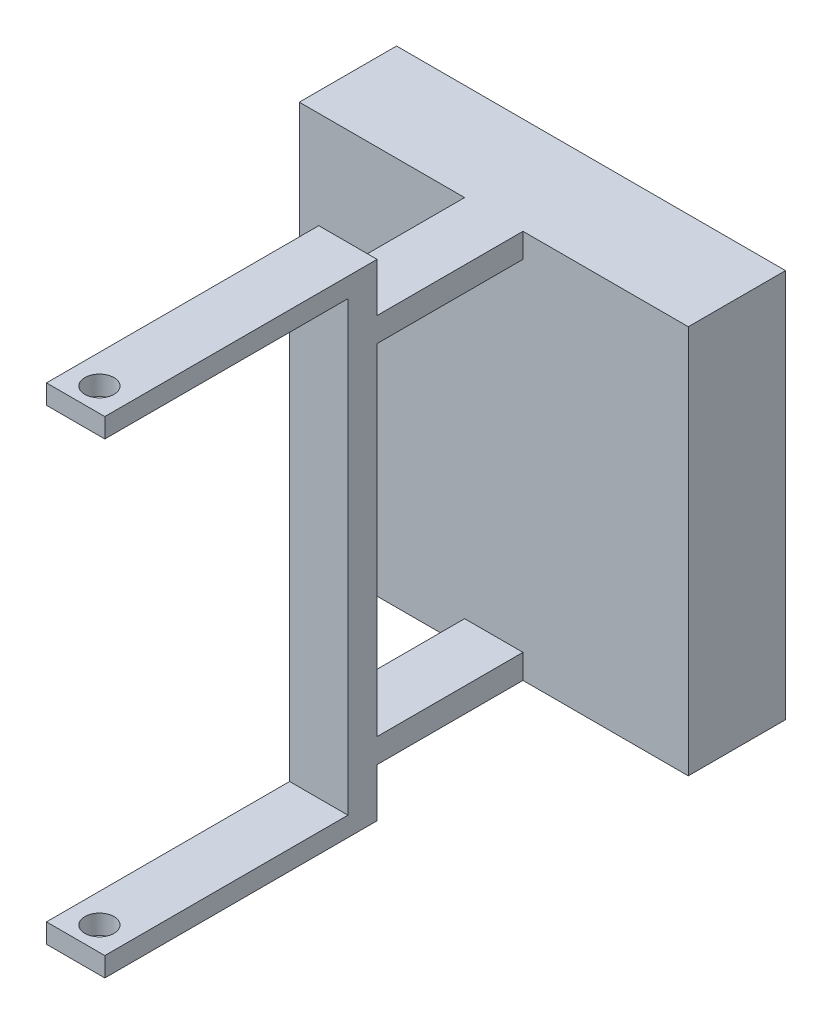
ISO-10303-21;
HEADER;
FILE_DESCRIPTION(('STEP AP214'),'2;1');
FILE_NAME('part.step','',(''),(''),'','','');
FILE_SCHEMA(('AUTOMOTIVE_DESIGN { 1 0 10303 214 1 1 1 1 }'));
ENDSEC;
DATA;
#1=APPLICATION_CONTEXT('core data for automotive mechanical design processes');
#2=APPLICATION_PROTOCOL_DEFINITION('international standard','automotive_design',2000,#1);
#3=PRODUCT_CONTEXT('',#1,'mechanical');
#4=PRODUCT('Part','Part','',(#3));
#5=PRODUCT_RELATED_PRODUCT_CATEGORY('part','',(#4));
#6=PRODUCT_DEFINITION_FORMATION('','',#4);
#7=PRODUCT_DEFINITION_CONTEXT('part definition',#1,'design');
#8=PRODUCT_DEFINITION('design','',#6,#7);
#9=PRODUCT_DEFINITION_SHAPE('','',#8);
#10=(LENGTH_UNIT() NAMED_UNIT(*) SI_UNIT(.MILLI.,.METRE.));
#11=(NAMED_UNIT(*) PLANE_ANGLE_UNIT() SI_UNIT($,.RADIAN.));
#12=(NAMED_UNIT(*) SI_UNIT($,.STERADIAN.) SOLID_ANGLE_UNIT());
#13=UNCERTAINTY_MEASURE_WITH_UNIT(LENGTH_MEASURE(1.E-05),#10,'distance_accuracy_value','');
#14=(GEOMETRIC_REPRESENTATION_CONTEXT(3) GLOBAL_UNCERTAINTY_ASSIGNED_CONTEXT((#13)) GLOBAL_UNIT_ASSIGNED_CONTEXT((#10,
#11,#12)) REPRESENTATION_CONTEXT('',''));
#15=CARTESIAN_POINT('',(0.,0.,0.));
#16=DIRECTION('',(0.,0.,1.));
#17=DIRECTION('',(1.,0.,0.));
#18=AXIS2_PLACEMENT_3D('',#15,#16,#17);
#19=CARTESIAN_POINT('',(0.,0.,10.));
#20=DIRECTION('',(0.,0.,-1.));
#21=DIRECTION('',(-1.,0.,0.));
#22=AXIS2_PLACEMENT_3D('',#19,#20,#21);
#23=PLANE('',#22);
#24=DIRECTION('',(-1.,0.,0.));
#25=VECTOR('',#24,1.);
#26=CARTESIAN_POINT('',(3.,17.5,10.));
#27=LINE('',#26,#25);
#28=CARTESIAN_POINT('',(3.,17.5,10.));
#29=VERTEX_POINT('',#28);
#30=CARTESIAN_POINT('',(-3.,17.5,10.));
#31=VERTEX_POINT('',#30);
#32=EDGE_CURVE('E261',#29,#31,#27,.T.);
#33=ORIENTED_EDGE('',*,*,#32,.T.);
#34=DIRECTION('',(0.,1.,0.));
#35=VECTOR('',#34,1.);
#36=CARTESIAN_POINT('',(-3.,17.5,10.));
#37=LINE('',#36,#35);
#38=CARTESIAN_POINT('',(-3.,20.,10.));
#39=VERTEX_POINT('',#38);
#40=EDGE_CURVE('E250',#31,#39,#37,.T.);
#41=ORIENTED_EDGE('',*,*,#40,.T.);
#42=DIRECTION('',(-1.,0.,0.));
#43=VECTOR('',#42,1.);
#44=CARTESIAN_POINT('',(-20.,20.,10.));
#45=LINE('',#44,#43);
#46=CARTESIAN_POINT('',(-20.,20.,10.));
#47=VERTEX_POINT('',#46);
#48=EDGE_CURVE('E305',#39,#47,#45,.T.);
#49=ORIENTED_EDGE('',*,*,#48,.T.);
#50=DIRECTION('',(0.,-1.,0.));
#51=VECTOR('',#50,1.);
#52=CARTESIAN_POINT('',(-20.,-20.,10.));
#53=LINE('',#52,#51);
#54=CARTESIAN_POINT('',(-20.,-20.,10.));
#55=VERTEX_POINT('',#54);
#56=EDGE_CURVE('E309',#47,#55,#53,.T.);
#57=ORIENTED_EDGE('',*,*,#56,.T.);
#58=DIRECTION('',(1.,0.,0.));
#59=VECTOR('',#58,1.);
#60=CARTESIAN_POINT('',(-20.,-20.,10.));
#61=LINE('',#60,#59);
#62=CARTESIAN_POINT('',(-3.,-20.,10.));
#63=VERTEX_POINT('',#62);
#64=EDGE_CURVE('E312',#55,#63,#61,.T.);
#65=ORIENTED_EDGE('',*,*,#64,.T.);
#66=DIRECTION('',(0.,-1.,0.));
#67=VECTOR('',#66,1.);
#68=CARTESIAN_POINT('',(-3.,-17.5,10.));
#69=LINE('',#68,#67);
#70=CARTESIAN_POINT('',(-3.,-17.5,10.));
#71=VERTEX_POINT('',#70);
#72=EDGE_CURVE('E280',#71,#63,#69,.T.);
#73=ORIENTED_EDGE('',*,*,#72,.F.);
#74=DIRECTION('',(-1.,0.,0.));
#75=VECTOR('',#74,1.);
#76=CARTESIAN_POINT('',(3.,-17.5,10.));
#77=LINE('',#76,#75);
#78=CARTESIAN_POINT('',(3.,-17.5,10.));
#79=VERTEX_POINT('',#78);
#80=EDGE_CURVE('E286',#79,#71,#77,.T.);
#81=ORIENTED_EDGE('',*,*,#80,.F.);
#82=DIRECTION('',(0.,1.,0.));
#83=VECTOR('',#82,1.);
#84=CARTESIAN_POINT('',(3.,-20.,10.));
#85=LINE('',#84,#83);
#86=CARTESIAN_POINT('',(3.,-20.,10.));
#87=VERTEX_POINT('',#86);
#88=EDGE_CURVE('E275',#87,#79,#85,.T.);
#89=ORIENTED_EDGE('',*,*,#88,.F.);
#90=CARTESIAN_POINT('',(20.,-20.,10.));
#91=VERTEX_POINT('',#90);
#92=EDGE_CURVE('E311',#87,#91,#61,.T.);
#93=ORIENTED_EDGE('',*,*,#92,.T.);
#94=DIRECTION('',(0.,1.,0.));
#95=VECTOR('',#94,1.);
#96=CARTESIAN_POINT('',(20.,-20.,10.));
#97=LINE('',#96,#95);
#98=CARTESIAN_POINT('',(20.,20.,10.));
#99=VERTEX_POINT('',#98);
#100=EDGE_CURVE('E302',#91,#99,#97,.T.);
#101=ORIENTED_EDGE('',*,*,#100,.T.);
#102=CARTESIAN_POINT('',(3.,20.,10.));
#103=VERTEX_POINT('',#102);
#104=EDGE_CURVE('E307',#99,#103,#45,.T.);
#105=ORIENTED_EDGE('',*,*,#104,.T.);
#106=DIRECTION('',(0.,-1.,0.));
#107=VECTOR('',#106,1.);
#108=CARTESIAN_POINT('',(3.,20.,10.));
#109=LINE('',#108,#107);
#110=EDGE_CURVE('E255',#103,#29,#109,.T.);
#111=ORIENTED_EDGE('',*,*,#110,.T.);
#112=EDGE_LOOP('',(#33,#41,#49,#57,#65,#73,#81,#89,#93,#101,#105,#111));
#113=FACE_BOUND('',#112,.T.);
#114=ADVANCED_FACE('F33',(#113),#23,.F.);
#115=CARTESIAN_POINT('',(20.,-20.,10.));
#116=DIRECTION('',(-1.,0.,0.));
#117=DIRECTION('',(0.,0.,1.));
#118=AXIS2_PLACEMENT_3D('',#115,#116,#117);
#119=PLANE('',#118);
#120=DIRECTION('',(0.,1.,0.));
#121=VECTOR('',#120,1.);
#122=CARTESIAN_POINT('',(20.,-20.,0.));
#123=LINE('',#122,#121);
#124=CARTESIAN_POINT('',(20.,-20.,0.));
#125=VERTEX_POINT('',#124);
#126=CARTESIAN_POINT('',(20.,20.,0.));
#127=VERTEX_POINT('',#126);
#128=EDGE_CURVE('E301',#125,#127,#123,.T.);
#129=ORIENTED_EDGE('',*,*,#128,.T.);
#130=DIRECTION('',(0.,0.,-1.));
#131=VECTOR('',#130,1.);
#132=CARTESIAN_POINT('',(20.,20.,10.));
#133=LINE('',#132,#131);
#134=EDGE_CURVE('E42',#99,#127,#133,.T.);
#135=ORIENTED_EDGE('',*,*,#134,.F.);
#136=ORIENTED_EDGE('',*,*,#100,.F.);
#137=DIRECTION('',(0.,0.,-1.));
#138=VECTOR('',#137,1.);
#139=CARTESIAN_POINT('',(20.,-20.,10.));
#140=LINE('',#139,#138);
#141=EDGE_CURVE('E314',#91,#125,#140,.T.);
#142=ORIENTED_EDGE('',*,*,#141,.T.);
#143=EDGE_LOOP('',(#129,#135,#136,#142));
#144=FACE_BOUND('',#143,.T.);
#145=ADVANCED_FACE('F35',(#144),#119,.F.);
#146=CARTESIAN_POINT('',(-20.,20.,10.));
#147=DIRECTION('',(0.,-1.,0.));
#148=DIRECTION('',(0.,0.,-1.));
#149=AXIS2_PLACEMENT_3D('',#146,#147,#148);
#150=PLANE('',#149);
#151=DIRECTION('',(-1.,0.,0.));
#152=VECTOR('',#151,1.);
#153=CARTESIAN_POINT('',(-20.,20.,0.));
#154=LINE('',#153,#152);
#155=CARTESIAN_POINT('',(-20.,20.,0.));
#156=VERTEX_POINT('',#155);
#157=EDGE_CURVE('E317',#127,#156,#154,.T.);
#158=ORIENTED_EDGE('',*,*,#157,.T.);
#159=DIRECTION('',(0.,0.,-1.));
#160=VECTOR('',#159,1.);
#161=CARTESIAN_POINT('',(-20.,20.,10.));
#162=LINE('',#161,#160);
#163=EDGE_CURVE('E327',#47,#156,#162,.T.);
#164=ORIENTED_EDGE('',*,*,#163,.F.);
#165=ORIENTED_EDGE('',*,*,#48,.F.);
#166=DIRECTION('',(0.,0.,-1.));
#167=VECTOR('',#166,1.);
#168=CARTESIAN_POINT('',(-3.,20.,25.));
#169=LINE('',#168,#167);
#170=CARTESIAN_POINT('',(-3.,20.,25.));
#171=VERTEX_POINT('',#170);
#172=EDGE_CURVE('E272',#171,#39,#169,.T.);
#173=ORIENTED_EDGE('',*,*,#172,.F.);
#174=DIRECTION('',(1.,0.,0.));
#175=VECTOR('',#174,1.);
#176=CARTESIAN_POINT('',(-3.,20.,25.));
#177=LINE('',#176,#175);
#178=CARTESIAN_POINT('',(3.,20.,25.));
#179=VERTEX_POINT('',#178);
#180=EDGE_CURVE('E251',#171,#179,#177,.T.);
#181=ORIENTED_EDGE('',*,*,#180,.T.);
#182=DIRECTION('',(0.,0.,-1.));
#183=VECTOR('',#182,1.);
#184=CARTESIAN_POINT('',(3.,20.,25.));
#185=LINE('',#184,#183);
#186=EDGE_CURVE('E258',#179,#103,#185,.T.);
#187=ORIENTED_EDGE('',*,*,#186,.T.);
#188=ORIENTED_EDGE('',*,*,#104,.F.);
#189=ORIENTED_EDGE('',*,*,#134,.T.);
#190=EDGE_LOOP('',(#158,#164,#165,#173,#181,#187,#188,#189));
#191=FACE_BOUND('',#190,.T.);
#192=ADVANCED_FACE('F332',(#191),#150,.F.);
#193=CARTESIAN_POINT('',(-20.,-20.,10.));
#194=DIRECTION('',(1.,0.,0.));
#195=DIRECTION('',(0.,0.,-1.));
#196=AXIS2_PLACEMENT_3D('',#193,#194,#195);
#197=PLANE('',#196);
#198=DIRECTION('',(0.,-1.,0.));
#199=VECTOR('',#198,1.);
#200=CARTESIAN_POINT('',(-20.,-20.,0.));
#201=LINE('',#200,#199);
#202=CARTESIAN_POINT('',(-20.,-20.,0.));
#203=VERTEX_POINT('',#202);
#204=EDGE_CURVE('E319',#156,#203,#201,.T.);
#205=ORIENTED_EDGE('',*,*,#204,.T.);
#206=DIRECTION('',(0.,0.,-1.));
#207=VECTOR('',#206,1.);
#208=CARTESIAN_POINT('',(-20.,-20.,10.));
#209=LINE('',#208,#207);
#210=EDGE_CURVE('E324',#55,#203,#209,.T.);
#211=ORIENTED_EDGE('',*,*,#210,.F.);
#212=ORIENTED_EDGE('',*,*,#56,.F.);
#213=ORIENTED_EDGE('',*,*,#163,.T.);
#214=EDGE_LOOP('',(#205,#211,#212,#213));
#215=FACE_BOUND('',#214,.T.);
#216=ADVANCED_FACE('F344',(#215),#197,.F.);
#217=CARTESIAN_POINT('',(-20.,-20.,10.));
#218=DIRECTION('',(0.,1.,0.));
#219=DIRECTION('',(0.,0.,1.));
#220=AXIS2_PLACEMENT_3D('',#217,#218,#219);
#221=PLANE('',#220);
#222=DIRECTION('',(1.,0.,0.));
#223=VECTOR('',#222,1.);
#224=CARTESIAN_POINT('',(-20.,-20.,0.));
#225=LINE('',#224,#223);
#226=EDGE_CURVE('E306',#203,#125,#225,.T.);
#227=ORIENTED_EDGE('',*,*,#226,.T.);
#228=ORIENTED_EDGE('',*,*,#141,.F.);
#229=ORIENTED_EDGE('',*,*,#92,.F.);
#230=DIRECTION('',(0.,0.,-1.));
#231=VECTOR('',#230,1.);
#232=CARTESIAN_POINT('',(3.,-20.,25.));
#233=LINE('',#232,#231);
#234=CARTESIAN_POINT('',(3.,-20.,25.));
#235=VERTEX_POINT('',#234);
#236=EDGE_CURVE('E298',#235,#87,#233,.T.);
#237=ORIENTED_EDGE('',*,*,#236,.F.);
#238=DIRECTION('',(1.,0.,0.));
#239=VECTOR('',#238,1.);
#240=CARTESIAN_POINT('',(-3.,-20.,25.));
#241=LINE('',#240,#239);
#242=CARTESIAN_POINT('',(-3.,-20.,25.));
#243=VERTEX_POINT('',#242);
#244=EDGE_CURVE('E276',#243,#235,#241,.T.);
#245=ORIENTED_EDGE('',*,*,#244,.F.);
#246=DIRECTION('',(0.,0.,-1.));
#247=VECTOR('',#246,1.);
#248=CARTESIAN_POINT('',(-3.,-20.,25.));
#249=LINE('',#248,#247);
#250=EDGE_CURVE('E283',#243,#63,#249,.T.);
#251=ORIENTED_EDGE('',*,*,#250,.T.);
#252=ORIENTED_EDGE('',*,*,#64,.F.);
#253=ORIENTED_EDGE('',*,*,#210,.T.);
#254=EDGE_LOOP('',(#227,#228,#229,#237,#245,#251,#252,#253));
#255=FACE_BOUND('',#254,.T.);
#256=ADVANCED_FACE('F348',(#255),#221,.F.);
#257=CARTESIAN_POINT('',(0.,0.,0.));
#258=DIRECTION('',(0.,0.,-1.));
#259=DIRECTION('',(-1.,0.,0.));
#260=AXIS2_PLACEMENT_3D('',#257,#258,#259);
#261=PLANE('',#260);
#262=CARTESIAN_POINT('',(0.,0.,0.));
#263=DIRECTION('',(0.,0.,-1.));
#264=DIRECTION('',(-1.,0.,0.));
#265=AXIS2_PLACEMENT_3D('',#262,#263,#264);
#266=CIRCLE('',#265,9.99999999999999);
#267=CARTESIAN_POINT('',(-10.,0.,0.));
#268=VERTEX_POINT('',#267);
#269=EDGE_CURVE('E11',#268,#268,#266,.T.);
#270=ORIENTED_EDGE('',*,*,#269,.F.);
#271=EDGE_LOOP('',(#270));
#272=FACE_BOUND('',#271,.T.);
#273=ORIENTED_EDGE('',*,*,#128,.F.);
#274=ORIENTED_EDGE('',*,*,#226,.F.);
#275=ORIENTED_EDGE('',*,*,#204,.F.);
#276=ORIENTED_EDGE('',*,*,#157,.F.);
#277=EDGE_LOOP('',(#273,#274,#275,#276));
#278=FACE_BOUND('',#277,.T.);
#279=ADVANCED_FACE('F340',(#272,#278),#261,.T.);
#280=CARTESIAN_POINT('',(3.,-20.,25.));
#281=DIRECTION('',(-1.,0.,0.));
#282=DIRECTION('',(0.,0.,1.));
#283=AXIS2_PLACEMENT_3D('',#280,#281,#282);
#284=PLANE('',#283);
#285=ORIENTED_EDGE('',*,*,#88,.T.);
#286=DIRECTION('',(0.,0.,-1.));
#287=VECTOR('',#286,1.);
#288=CARTESIAN_POINT('',(3.,-17.5,25.));
#289=LINE('',#288,#287);
#290=CARTESIAN_POINT('',(3.,-17.5,25.));
#291=VERTEX_POINT('',#290);
#292=EDGE_CURVE('E295',#291,#79,#289,.T.);
#293=ORIENTED_EDGE('',*,*,#292,.F.);
#294=DIRECTION('',(0.,1.,0.));
#295=VECTOR('',#294,1.);
#296=CARTESIAN_POINT('',(3.,25.,25.));
#297=LINE('',#296,#295);
#298=CARTESIAN_POINT('',(3.,17.5,25.));
#299=VERTEX_POINT('',#298);
#300=EDGE_CURVE('E238',#291,#299,#297,.T.);
#301=ORIENTED_EDGE('',*,*,#300,.T.);
#302=DIRECTION('',(0.,0.,-1.));
#303=VECTOR('',#302,1.);
#304=CARTESIAN_POINT('',(3.,17.5,25.));
#305=LINE('',#304,#303);
#306=EDGE_CURVE('E266',#299,#29,#305,.T.);
#307=ORIENTED_EDGE('',*,*,#306,.T.);
#308=ORIENTED_EDGE('',*,*,#110,.F.);
#309=ORIENTED_EDGE('',*,*,#186,.F.);
#310=CARTESIAN_POINT('',(3.,25.,25.));
#311=VERTEX_POINT('',#310);
#312=EDGE_CURVE('E229',#179,#311,#297,.T.);
#313=ORIENTED_EDGE('',*,*,#312,.T.);
#314=DIRECTION('',(0.,0.,-1.));
#315=VECTOR('',#314,1.);
#316=CARTESIAN_POINT('',(3.,25.,28.));
#317=LINE('',#316,#315);
#318=CARTESIAN_POINT('',(3.,25.,53.));
#319=VERTEX_POINT('',#318);
#320=EDGE_CURVE('E183',#319,#311,#317,.T.);
#321=ORIENTED_EDGE('',*,*,#320,.F.);
#322=DIRECTION('',(0.,-1.,0.));
#323=VECTOR('',#322,1.);
#324=CARTESIAN_POINT('',(3.,25.,53.));
#325=LINE('',#324,#323);
#326=CARTESIAN_POINT('',(3.,23.,53.));
#327=VERTEX_POINT('',#326);
#328=EDGE_CURVE('E193',#319,#327,#325,.T.);
#329=ORIENTED_EDGE('',*,*,#328,.T.);
#330=DIRECTION('',(0.,0.,-1.));
#331=VECTOR('',#330,1.);
#332=CARTESIAN_POINT('',(3.,23.,53.));
#333=LINE('',#332,#331);
#334=CARTESIAN_POINT('',(3.,23.,28.));
#335=VERTEX_POINT('',#334);
#336=EDGE_CURVE('E205',#327,#335,#333,.T.);
#337=ORIENTED_EDGE('',*,*,#336,.T.);
#338=DIRECTION('',(0.,1.,0.));
#339=VECTOR('',#338,1.);
#340=CARTESIAN_POINT('',(3.,25.,28.));
#341=LINE('',#340,#339);
#342=CARTESIAN_POINT('',(3.,-23.,28.));
#343=VERTEX_POINT('',#342);
#344=EDGE_CURVE('E55',#343,#335,#341,.T.);
#345=ORIENTED_EDGE('',*,*,#344,.F.);
#346=DIRECTION('',(0.,0.,-1.));
#347=VECTOR('',#346,1.);
#348=CARTESIAN_POINT('',(3.,-23.,53.));
#349=LINE('',#348,#347);
#350=CARTESIAN_POINT('',(3.,-23.,53.));
#351=VERTEX_POINT('',#350);
#352=EDGE_CURVE('E226',#351,#343,#349,.T.);
#353=ORIENTED_EDGE('',*,*,#352,.F.);
#354=DIRECTION('',(0.,1.,0.));
#355=VECTOR('',#354,1.);
#356=CARTESIAN_POINT('',(3.,-25.,53.));
#357=LINE('',#356,#355);
#358=CARTESIAN_POINT('',(3.,-25.,53.));
#359=VERTEX_POINT('',#358);
#360=EDGE_CURVE('E214',#359,#351,#357,.T.);
#361=ORIENTED_EDGE('',*,*,#360,.F.);
#362=DIRECTION('',(0.,0.,-1.));
#363=VECTOR('',#362,1.);
#364=CARTESIAN_POINT('',(3.,-25.,28.));
#365=LINE('',#364,#363);
#366=CARTESIAN_POINT('',(3.,-25.,25.));
#367=VERTEX_POINT('',#366);
#368=EDGE_CURVE('E234',#359,#367,#365,.T.);
#369=ORIENTED_EDGE('',*,*,#368,.T.);
#370=EDGE_CURVE('E235',#367,#235,#297,.T.);
#371=ORIENTED_EDGE('',*,*,#370,.T.);
#372=ORIENTED_EDGE('',*,*,#236,.T.);
#373=EDGE_LOOP('',(#285,#293,#301,#307,#308,#309,#313,#321,#329,#337,#345,#353,#361,#369,#371,#372));
#374=FACE_BOUND('',#373,.T.);
#375=ADVANCED_FACE('F363',(#374),#284,.F.);
#376=CARTESIAN_POINT('',(3.,-17.5,25.));
#377=DIRECTION('',(0.,-1.,0.));
#378=DIRECTION('',(0.,0.,-1.));
#379=AXIS2_PLACEMENT_3D('',#376,#377,#378);
#380=PLANE('',#379);
#381=ORIENTED_EDGE('',*,*,#80,.T.);
#382=DIRECTION('',(0.,0.,-1.));
#383=VECTOR('',#382,1.);
#384=CARTESIAN_POINT('',(-3.,-17.5,25.));
#385=LINE('',#384,#383);
#386=CARTESIAN_POINT('',(-3.,-17.5,25.));
#387=VERTEX_POINT('',#386);
#388=EDGE_CURVE('E292',#387,#71,#385,.T.);
#389=ORIENTED_EDGE('',*,*,#388,.F.);
#390=DIRECTION('',(-1.,0.,0.));
#391=VECTOR('',#390,1.);
#392=CARTESIAN_POINT('',(3.,-17.5,25.));
#393=LINE('',#392,#391);
#394=EDGE_CURVE('E279',#291,#387,#393,.T.);
#395=ORIENTED_EDGE('',*,*,#394,.F.);
#396=ORIENTED_EDGE('',*,*,#292,.T.);
#397=EDGE_LOOP('',(#381,#389,#395,#396));
#398=FACE_BOUND('',#397,.T.);
#399=ADVANCED_FACE('F355',(#398),#380,.F.);
#400=CARTESIAN_POINT('',(-3.,-17.5,25.));
#401=DIRECTION('',(1.,0.,0.));
#402=DIRECTION('',(0.,0.,-1.));
#403=AXIS2_PLACEMENT_3D('',#400,#401,#402);
#404=PLANE('',#403);
#405=ORIENTED_EDGE('',*,*,#72,.T.);
#406=ORIENTED_EDGE('',*,*,#250,.F.);
#407=DIRECTION('',(0.,-1.,0.));
#408=VECTOR('',#407,1.);
#409=CARTESIAN_POINT('',(-3.,25.,25.));
#410=LINE('',#409,#408);
#411=CARTESIAN_POINT('',(-3.,-25.,25.));
#412=VERTEX_POINT('',#411);
#413=EDGE_CURVE('E240',#243,#412,#410,.T.);
#414=ORIENTED_EDGE('',*,*,#413,.T.);
#415=DIRECTION('',(0.,0.,-1.));
#416=VECTOR('',#415,1.);
#417=CARTESIAN_POINT('',(-3.,-25.,28.));
#418=LINE('',#417,#416);
#419=CARTESIAN_POINT('',(-3.,-25.,53.));
#420=VERTEX_POINT('',#419);
#421=EDGE_CURVE('E184',#420,#412,#418,.T.);
#422=ORIENTED_EDGE('',*,*,#421,.F.);
#423=DIRECTION('',(0.,-1.,0.));
#424=VECTOR('',#423,1.);
#425=CARTESIAN_POINT('',(-3.,-23.,53.));
#426=LINE('',#425,#424);
#427=CARTESIAN_POINT('',(-3.,-23.,53.));
#428=VERTEX_POINT('',#427);
#429=EDGE_CURVE('E218',#428,#420,#426,.T.);
#430=ORIENTED_EDGE('',*,*,#429,.F.);
#431=DIRECTION('',(0.,0.,-1.));
#432=VECTOR('',#431,1.);
#433=CARTESIAN_POINT('',(-3.,-23.,53.));
#434=LINE('',#433,#432);
#435=CARTESIAN_POINT('',(-3.,-23.,28.));
#436=VERTEX_POINT('',#435);
#437=EDGE_CURVE('E221',#428,#436,#434,.T.);
#438=ORIENTED_EDGE('',*,*,#437,.T.);
#439=DIRECTION('',(0.,-1.,0.));
#440=VECTOR('',#439,1.);
#441=CARTESIAN_POINT('',(-3.,25.,28.));
#442=LINE('',#441,#440);
#443=CARTESIAN_POINT('',(-3.,23.,28.));
#444=VERTEX_POINT('',#443);
#445=EDGE_CURVE('E231',#444,#436,#442,.T.);
#446=ORIENTED_EDGE('',*,*,#445,.F.);
#447=DIRECTION('',(0.,0.,-1.));
#448=VECTOR('',#447,1.);
#449=CARTESIAN_POINT('',(-3.,23.,53.));
#450=LINE('',#449,#448);
#451=CARTESIAN_POINT('',(-3.,23.,53.));
#452=VERTEX_POINT('',#451);
#453=EDGE_CURVE('E198',#452,#444,#450,.T.);
#454=ORIENTED_EDGE('',*,*,#453,.F.);
#455=DIRECTION('',(0.,1.,0.));
#456=VECTOR('',#455,1.);
#457=CARTESIAN_POINT('',(-3.,23.,53.));
#458=LINE('',#457,#456);
#459=CARTESIAN_POINT('',(-3.,25.,53.));
#460=VERTEX_POINT('',#459);
#461=EDGE_CURVE('E190',#452,#460,#458,.T.);
#462=ORIENTED_EDGE('',*,*,#461,.T.);
#463=DIRECTION('',(0.,0.,-1.));
#464=VECTOR('',#463,1.);
#465=CARTESIAN_POINT('',(-3.,25.,28.));
#466=LINE('',#465,#464);
#467=CARTESIAN_POINT('',(-3.,25.,25.));
#468=VERTEX_POINT('',#467);
#469=EDGE_CURVE('E171',#460,#468,#466,.T.);
#470=ORIENTED_EDGE('',*,*,#469,.T.);
#471=EDGE_CURVE('E241',#468,#171,#410,.T.);
#472=ORIENTED_EDGE('',*,*,#471,.T.);
#473=ORIENTED_EDGE('',*,*,#172,.T.);
#474=ORIENTED_EDGE('',*,*,#40,.F.);
#475=DIRECTION('',(0.,0.,-1.));
#476=VECTOR('',#475,1.);
#477=CARTESIAN_POINT('',(-3.,17.5,25.));
#478=LINE('',#477,#476);
#479=CARTESIAN_POINT('',(-3.,17.5,25.));
#480=VERTEX_POINT('',#479);
#481=EDGE_CURVE('E269',#480,#31,#478,.T.);
#482=ORIENTED_EDGE('',*,*,#481,.F.);
#483=EDGE_CURVE('E243',#480,#387,#410,.T.);
#484=ORIENTED_EDGE('',*,*,#483,.T.);
#485=ORIENTED_EDGE('',*,*,#388,.T.);
#486=EDGE_LOOP('',(#405,#406,#414,#422,#430,#438,#446,#454,#462,#470,#472,#473,#474,#482,#484,#485));
#487=FACE_BOUND('',#486,.T.);
#488=ADVANCED_FACE('F196',(#487),#404,.F.);
#489=CARTESIAN_POINT('',(3.,17.5,25.));
#490=DIRECTION('',(0.,-1.,0.));
#491=DIRECTION('',(0.,0.,-1.));
#492=AXIS2_PLACEMENT_3D('',#489,#490,#491);
#493=PLANE('',#492);
#494=ORIENTED_EDGE('',*,*,#32,.F.);
#495=ORIENTED_EDGE('',*,*,#306,.F.);
#496=DIRECTION('',(-1.,0.,0.));
#497=VECTOR('',#496,1.);
#498=CARTESIAN_POINT('',(3.,17.5,25.));
#499=LINE('',#498,#497);
#500=EDGE_CURVE('E254',#299,#480,#499,.T.);
#501=ORIENTED_EDGE('',*,*,#500,.T.);
#502=ORIENTED_EDGE('',*,*,#481,.T.);
#503=EDGE_LOOP('',(#494,#495,#501,#502));
#504=FACE_BOUND('',#503,.T.);
#505=ADVANCED_FACE('F371',(#504),#493,.T.);
#506=CARTESIAN_POINT('',(0.,0.,25.));
#507=DIRECTION('',(0.,0.,1.));
#508=DIRECTION('',(1.,0.,0.));
#509=AXIS2_PLACEMENT_3D('',#506,#507,#508);
#510=PLANE('',#509);
#511=ORIENTED_EDGE('',*,*,#413,.F.);
#512=ORIENTED_EDGE('',*,*,#244,.T.);
#513=ORIENTED_EDGE('',*,*,#370,.F.);
#514=DIRECTION('',(1.,0.,0.));
#515=VECTOR('',#514,1.);
#516=CARTESIAN_POINT('',(-3.,-25.,25.));
#517=LINE('',#516,#515);
#518=EDGE_CURVE('E232',#412,#367,#517,.T.);
#519=ORIENTED_EDGE('',*,*,#518,.F.);
#520=EDGE_LOOP('',(#511,#512,#513,#519));
#521=FACE_BOUND('',#520,.T.);
#522=ADVANCED_FACE('F378',(#521),#510,.F.);
#523=ORIENTED_EDGE('',*,*,#300,.F.);
#524=ORIENTED_EDGE('',*,*,#394,.T.);
#525=ORIENTED_EDGE('',*,*,#483,.F.);
#526=ORIENTED_EDGE('',*,*,#500,.F.);
#527=EDGE_LOOP('',(#523,#524,#525,#526));
#528=FACE_BOUND('',#527,.T.);
#529=ADVANCED_FACE('F358',(#528),#510,.F.);
#530=ORIENTED_EDGE('',*,*,#180,.F.);
#531=ORIENTED_EDGE('',*,*,#471,.F.);
#532=DIRECTION('',(-1.,0.,0.));
#533=VECTOR('',#532,1.);
#534=CARTESIAN_POINT('',(-3.,25.,25.));
#535=LINE('',#534,#533);
#536=EDGE_CURVE('E178',#311,#468,#535,.T.);
#537=ORIENTED_EDGE('',*,*,#536,.F.);
#538=ORIENTED_EDGE('',*,*,#312,.F.);
#539=EDGE_LOOP('',(#530,#531,#537,#538));
#540=FACE_BOUND('',#539,.T.);
#541=ADVANCED_FACE('F366',(#540),#510,.F.);
#542=CARTESIAN_POINT('',(-3.,25.,28.));
#543=DIRECTION('',(0.,-1.,0.));
#544=DIRECTION('',(0.,0.,-1.));
#545=AXIS2_PLACEMENT_3D('',#542,#543,#544);
#546=PLANE('',#545);
#547=CARTESIAN_POINT('',(0.,25.,50.5556619782865));
#548=DIRECTION('',(0.,-1.,0.));
#549=DIRECTION('',(0.,0.,-1.));
#550=AXIS2_PLACEMENT_3D('',#547,#548,#549);
#551=CIRCLE('',#550,1.5);
#552=CARTESIAN_POINT('',(0.,25.,49.0556619782865));
#553=VERTEX_POINT('',#552);
#554=EDGE_CURVE('E207',#553,#553,#551,.T.);
#555=ORIENTED_EDGE('',*,*,#554,.T.);
#556=EDGE_LOOP('',(#555));
#557=FACE_BOUND('',#556,.T.);
#558=ORIENTED_EDGE('',*,*,#536,.T.);
#559=ORIENTED_EDGE('',*,*,#469,.F.);
#560=DIRECTION('',(1.,0.,0.));
#561=VECTOR('',#560,1.);
#562=CARTESIAN_POINT('',(-3.,25.,53.));
#563=LINE('',#562,#561);
#564=EDGE_CURVE('E175',#460,#319,#563,.T.);
#565=ORIENTED_EDGE('',*,*,#564,.T.);
#566=ORIENTED_EDGE('',*,*,#320,.T.);
#567=EDGE_LOOP('',(#558,#559,#565,#566));
#568=FACE_BOUND('',#567,.T.);
#569=ADVANCED_FACE('F173',(#557,#568),#546,.F.);
#570=CARTESIAN_POINT('',(-3.,-25.,28.));
#571=DIRECTION('',(0.,1.,0.));
#572=DIRECTION('',(0.,0.,1.));
#573=AXIS2_PLACEMENT_3D('',#570,#571,#572);
#574=PLANE('',#573);
#575=CARTESIAN_POINT('',(0.,-25.,50.5556619782865));
#576=DIRECTION('',(0.,-1.,0.));
#577=DIRECTION('',(0.,0.,-1.));
#578=AXIS2_PLACEMENT_3D('',#575,#576,#577);
#579=CIRCLE('',#578,1.5);
#580=CARTESIAN_POINT('',(0.,-25.,49.0556619782865));
#581=VERTEX_POINT('',#580);
#582=EDGE_CURVE('E579',#581,#581,#579,.T.);
#583=ORIENTED_EDGE('',*,*,#582,.F.);
#584=EDGE_LOOP('',(#583));
#585=FACE_BOUND('',#584,.T.);
#586=ORIENTED_EDGE('',*,*,#518,.T.);
#587=ORIENTED_EDGE('',*,*,#368,.F.);
#588=DIRECTION('',(1.,0.,0.));
#589=VECTOR('',#588,1.);
#590=CARTESIAN_POINT('',(-3.,-25.,53.));
#591=LINE('',#590,#589);
#592=EDGE_CURVE('E211',#420,#359,#591,.T.);
#593=ORIENTED_EDGE('',*,*,#592,.F.);
#594=ORIENTED_EDGE('',*,*,#421,.T.);
#595=EDGE_LOOP('',(#586,#587,#593,#594));
#596=FACE_BOUND('',#595,.T.);
#597=ADVANCED_FACE('F382',(#585,#596),#574,.F.);
#598=CARTESIAN_POINT('',(0.,0.,28.));
#599=DIRECTION('',(0.,0.,1.));
#600=DIRECTION('',(1.,0.,0.));
#601=AXIS2_PLACEMENT_3D('',#598,#599,#600);
#602=PLANE('',#601);
#603=DIRECTION('',(-1.,0.,0.));
#604=VECTOR('',#603,1.);
#605=CARTESIAN_POINT('',(3.,23.,28.));
#606=LINE('',#605,#604);
#607=EDGE_CURVE('E50',#335,#444,#606,.T.);
#608=ORIENTED_EDGE('',*,*,#607,.T.);
#609=ORIENTED_EDGE('',*,*,#445,.T.);
#610=DIRECTION('',(-1.,0.,0.));
#611=VECTOR('',#610,1.);
#612=CARTESIAN_POINT('',(3.,-23.,28.));
#613=LINE('',#612,#611);
#614=EDGE_CURVE('E210',#343,#436,#613,.T.);
#615=ORIENTED_EDGE('',*,*,#614,.F.);
#616=ORIENTED_EDGE('',*,*,#344,.T.);
#617=EDGE_LOOP('',(#608,#609,#615,#616));
#618=FACE_BOUND('',#617,.T.);
#619=ADVANCED_FACE('F390',(#618),#602,.T.);
#620=CARTESIAN_POINT('',(3.,-23.,53.));
#621=DIRECTION('',(0.,-1.,0.));
#622=DIRECTION('',(1.,0.,0.));
#623=AXIS2_PLACEMENT_3D('',#620,#621,#622);
#624=PLANE('',#623);
#625=CARTESIAN_POINT('',(0.,-23.,50.5556619782865));
#626=DIRECTION('',(0.,-1.,0.));
#627=DIRECTION('',(1.,0.,0.));
#628=AXIS2_PLACEMENT_3D('',#625,#626,#627);
#629=CIRCLE('',#628,1.5);
#630=CARTESIAN_POINT('',(1.5,-23.,50.5556619782865));
#631=VERTEX_POINT('',#630);
#632=EDGE_CURVE('E584',#631,#631,#629,.T.);
#633=ORIENTED_EDGE('',*,*,#632,.T.);
#634=EDGE_LOOP('',(#633));
#635=FACE_BOUND('',#634,.T.);
#636=ORIENTED_EDGE('',*,*,#614,.T.);
#637=ORIENTED_EDGE('',*,*,#437,.F.);
#638=DIRECTION('',(-1.,0.,0.));
#639=VECTOR('',#638,1.);
#640=CARTESIAN_POINT('',(3.,-23.,53.));
#641=LINE('',#640,#639);
#642=EDGE_CURVE('E216',#351,#428,#641,.T.);
#643=ORIENTED_EDGE('',*,*,#642,.F.);
#644=ORIENTED_EDGE('',*,*,#352,.T.);
#645=EDGE_LOOP('',(#636,#637,#643,#644));
#646=FACE_BOUND('',#645,.T.);
#647=ADVANCED_FACE('F389',(#635,#646),#624,.F.);
#648=CARTESIAN_POINT('',(0.,0.,53.));
#649=DIRECTION('',(0.,0.,1.));
#650=DIRECTION('',(1.,0.,0.));
#651=AXIS2_PLACEMENT_3D('',#648,#649,#650);
#652=PLANE('',#651);
#653=ORIENTED_EDGE('',*,*,#592,.T.);
#654=ORIENTED_EDGE('',*,*,#360,.T.);
#655=ORIENTED_EDGE('',*,*,#642,.T.);
#656=ORIENTED_EDGE('',*,*,#429,.T.);
#657=EDGE_LOOP('',(#653,#654,#655,#656));
#658=FACE_BOUND('',#657,.T.);
#659=ADVANCED_FACE('F384',(#658),#652,.T.);
#660=CARTESIAN_POINT('',(3.,23.,53.));
#661=DIRECTION('',(0.,-1.,0.));
#662=DIRECTION('',(1.,0.,0.));
#663=AXIS2_PLACEMENT_3D('',#660,#661,#662);
#664=PLANE('',#663);
#665=CARTESIAN_POINT('',(0.,23.,50.5556619782865));
#666=DIRECTION('',(0.,-1.,0.));
#667=DIRECTION('',(1.,0.,0.));
#668=AXIS2_PLACEMENT_3D('',#665,#666,#667);
#669=CIRCLE('',#668,1.5);
#670=CARTESIAN_POINT('',(1.5,23.,50.5556619782865));
#671=VERTEX_POINT('',#670);
#672=EDGE_CURVE('E37',#671,#671,#669,.T.);
#673=ORIENTED_EDGE('',*,*,#672,.F.);
#674=EDGE_LOOP('',(#673));
#675=FACE_BOUND('',#674,.T.);
#676=ORIENTED_EDGE('',*,*,#607,.F.);
#677=ORIENTED_EDGE('',*,*,#336,.F.);
#678=DIRECTION('',(-1.,0.,0.));
#679=VECTOR('',#678,1.);
#680=CARTESIAN_POINT('',(3.,23.,53.));
#681=LINE('',#680,#679);
#682=EDGE_CURVE('E199',#327,#452,#681,.T.);
#683=ORIENTED_EDGE('',*,*,#682,.T.);
#684=ORIENTED_EDGE('',*,*,#453,.T.);
#685=EDGE_LOOP('',(#676,#677,#683,#684));
#686=FACE_BOUND('',#685,.T.);
#687=ADVANCED_FACE('F392',(#675,#686),#664,.T.);
#688=CARTESIAN_POINT('',(0.,0.,53.));
#689=DIRECTION('',(0.,0.,1.));
#690=DIRECTION('',(1.,0.,0.));
#691=AXIS2_PLACEMENT_3D('',#688,#689,#690);
#692=PLANE('',#691);
#693=ORIENTED_EDGE('',*,*,#564,.F.);
#694=ORIENTED_EDGE('',*,*,#461,.F.);
#695=ORIENTED_EDGE('',*,*,#682,.F.);
#696=ORIENTED_EDGE('',*,*,#328,.F.);
#697=EDGE_LOOP('',(#693,#694,#695,#696));
#698=FACE_BOUND('',#697,.T.);
#699=ADVANCED_FACE('F188',(#698),#692,.T.);
#700=CARTESIAN_POINT('',(0.,40.,50.5556619782865));
#701=DIRECTION('',(0.,-1.,0.));
#702=DIRECTION('',(0.,0.,-1.));
#703=AXIS2_PLACEMENT_3D('',#700,#701,#702);
#704=CYLINDRICAL_SURFACE('',#703,1.5);
#705=ORIENTED_EDGE('',*,*,#672,.T.);
#706=EDGE_LOOP('',(#705));
#707=FACE_BOUND('',#706,.T.);
#708=ORIENTED_EDGE('',*,*,#554,.F.);
#709=EDGE_LOOP('',(#708));
#710=FACE_BOUND('',#709,.T.);
#711=ADVANCED_FACE('F400',(#707,#710),#704,.F.);
#712=ORIENTED_EDGE('',*,*,#582,.T.);
#713=EDGE_LOOP('',(#712));
#714=FACE_BOUND('',#713,.T.);
#715=ORIENTED_EDGE('',*,*,#632,.F.);
#716=EDGE_LOOP('',(#715));
#717=FACE_BOUND('',#716,.T.);
#718=ADVANCED_FACE('F545',(#714,#717),#704,.F.);
#719=CARTESIAN_POINT('',(0.,0.,-5.));
#720=DIRECTION('',(0.,0.,1.));
#721=DIRECTION('',(1.,0.,0.));
#722=AXIS2_PLACEMENT_3D('',#719,#720,#721);
#723=CYLINDRICAL_SURFACE('',#722,9.99999999999999);
#724=CARTESIAN_POINT('',(0.,0.,-5.));
#725=DIRECTION('',(0.,0.,-1.));
#726=DIRECTION('',(-1.,0.,0.));
#727=AXIS2_PLACEMENT_3D('',#724,#725,#726);
#728=CIRCLE('',#727,9.99999999999999);
#729=CARTESIAN_POINT('',(-10.,0.,-5.));
#730=VERTEX_POINT('',#729);
#731=EDGE_CURVE('E578',#730,#730,#728,.T.);
#732=ORIENTED_EDGE('',*,*,#731,.F.);
#733=EDGE_LOOP('',(#732));
#734=FACE_BOUND('',#733,.T.);
#735=ORIENTED_EDGE('',*,*,#269,.T.);
#736=EDGE_LOOP('',(#735));
#737=FACE_BOUND('',#736,.T.);
#738=ADVANCED_FACE('F553',(#734,#737),#723,.T.);
#739=CARTESIAN_POINT('',(0.,0.,-5.));
#740=DIRECTION('',(0.,0.,-1.));
#741=DIRECTION('',(-1.,0.,0.));
#742=AXIS2_PLACEMENT_3D('',#739,#740,#741);
#743=PLANE('',#742);
#744=ORIENTED_EDGE('',*,*,#731,.T.);
#745=EDGE_LOOP('',(#744));
#746=FACE_BOUND('',#745,.T.);
#747=ADVANCED_FACE('F560',(#746),#743,.T.);
#748=CLOSED_SHELL('',(#114,#145,#192,#216,#256,#279,#375,#399,#488,#505,#522,#529,#541,#569,
#597,#619,#647,#659,#687,#699,#711,#718,#738,#747));
#749=MANIFOLD_SOLID_BREP('B2',#748);
#750=ADVANCED_BREP_SHAPE_REPRESENTATION('',(#18,#749),#14);
#751=SHAPE_DEFINITION_REPRESENTATION(#9,#750);
ENDSEC;
END-ISO-10303-21;
